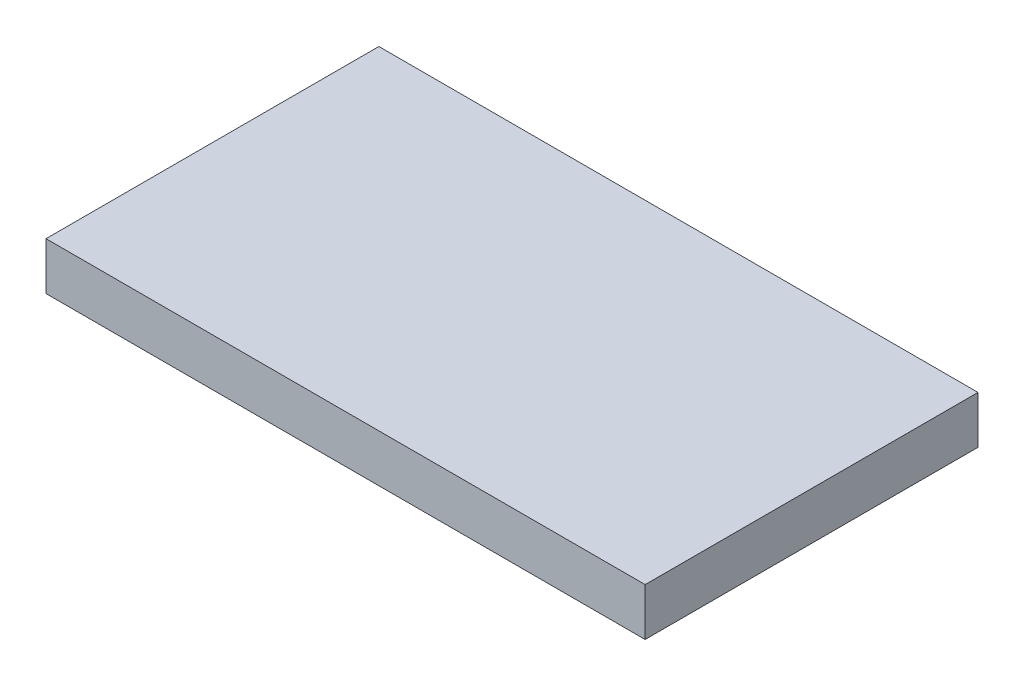
ISO-10303-21;
HEADER;
FILE_DESCRIPTION(('STEP AP214'),'2;1');
FILE_NAME('part.step','',(''),(''),'','','');
FILE_SCHEMA(('AUTOMOTIVE_DESIGN { 1 0 10303 214 1 1 1 1 }'));
ENDSEC;
DATA;
#1=APPLICATION_CONTEXT('core data for automotive mechanical design processes');
#2=APPLICATION_PROTOCOL_DEFINITION('international standard','automotive_design',2000,#1);
#3=PRODUCT_CONTEXT('',#1,'mechanical');
#4=PRODUCT('Part','Part','',(#3));
#5=PRODUCT_RELATED_PRODUCT_CATEGORY('part','',(#4));
#6=PRODUCT_DEFINITION_FORMATION('','',#4);
#7=PRODUCT_DEFINITION_CONTEXT('part definition',#1,'design');
#8=PRODUCT_DEFINITION('design','',#6,#7);
#9=PRODUCT_DEFINITION_SHAPE('','',#8);
#10=(LENGTH_UNIT() NAMED_UNIT(*) SI_UNIT(.MILLI.,.METRE.));
#11=(NAMED_UNIT(*) PLANE_ANGLE_UNIT() SI_UNIT($,.RADIAN.));
#12=(NAMED_UNIT(*) SI_UNIT($,.STERADIAN.) SOLID_ANGLE_UNIT());
#13=UNCERTAINTY_MEASURE_WITH_UNIT(LENGTH_MEASURE(1.E-05),#10,'distance_accuracy_value','');
#14=(GEOMETRIC_REPRESENTATION_CONTEXT(3) GLOBAL_UNCERTAINTY_ASSIGNED_CONTEXT((#13)) GLOBAL_UNIT_ASSIGNED_CONTEXT((#10,
#11,#12)) REPRESENTATION_CONTEXT('',''));
#15=CARTESIAN_POINT('',(0.,0.,0.));
#16=DIRECTION('',(0.,0.,1.));
#17=DIRECTION('',(1.,0.,0.));
#18=AXIS2_PLACEMENT_3D('',#15,#16,#17);
#19=CARTESIAN_POINT('',(-51.6509531623004,5.,-20.3195374115649));
#20=DIRECTION('',(1.,0.,0.));
#21=DIRECTION('',(0.,0.,-1.));
#22=AXIS2_PLACEMENT_3D('',#19,#20,#21);
#23=PLANE('',#22);
#24=DIRECTION('',(0.,0.,1.));
#25=VECTOR('',#24,1.);
#26=CARTESIAN_POINT('',(-51.6509531623004,0.,-20.3195374115649));
#27=LINE('',#26,#25);
#28=CARTESIAN_POINT('',(-51.6509531623004,0.,-20.3195374115649));
#29=VERTEX_POINT('',#28);
#30=CARTESIAN_POINT('',(-51.6509531623004,0.,14.6804625884351));
#31=VERTEX_POINT('',#30);
#32=EDGE_CURVE('E95',#29,#31,#27,.T.);
#33=ORIENTED_EDGE('',*,*,#32,.T.);
#34=DIRECTION('',(0.,-1.,0.));
#35=VECTOR('',#34,1.);
#36=CARTESIAN_POINT('',(-51.6509531623004,5.,14.6804625884351));
#37=LINE('',#36,#35);
#38=CARTESIAN_POINT('',(-51.6509531623004,5.,14.6804625884351));
#39=VERTEX_POINT('',#38);
#40=EDGE_CURVE('E11',#39,#31,#37,.T.);
#41=ORIENTED_EDGE('',*,*,#40,.F.);
#42=DIRECTION('',(0.,0.,1.));
#43=VECTOR('',#42,1.);
#44=CARTESIAN_POINT('',(-51.6509531623004,5.,-20.3195374115649));
#45=LINE('',#44,#43);
#46=CARTESIAN_POINT('',(-51.6509531623004,5.,-20.3195374115649));
#47=VERTEX_POINT('',#46);
#48=EDGE_CURVE('E83',#47,#39,#45,.T.);
#49=ORIENTED_EDGE('',*,*,#48,.F.);
#50=DIRECTION('',(0.,-1.,0.));
#51=VECTOR('',#50,1.);
#52=CARTESIAN_POINT('',(-51.6509531623004,5.,-20.3195374115649));
#53=LINE('',#52,#51);
#54=EDGE_CURVE('E91',#47,#29,#53,.T.);
#55=ORIENTED_EDGE('',*,*,#54,.T.);
#56=EDGE_LOOP('',(#33,#41,#49,#55));
#57=FACE_BOUND('',#56,.T.);
#58=ADVANCED_FACE('F32',(#57),#23,.F.);
#59=CARTESIAN_POINT('',(-51.6509531623004,5.,14.6804625884351));
#60=DIRECTION('',(0.,0.,-1.));
#61=DIRECTION('',(-1.,0.,0.));
#62=AXIS2_PLACEMENT_3D('',#59,#60,#61);
#63=PLANE('',#62);
#64=DIRECTION('',(1.,0.,0.));
#65=VECTOR('',#64,1.);
#66=CARTESIAN_POINT('',(-51.6509531623004,0.,14.6804625884351));
#67=LINE('',#66,#65);
#68=CARTESIAN_POINT('',(11.3490468376996,0.,14.6804625884351));
#69=VERTEX_POINT('',#68);
#70=EDGE_CURVE('E87',#31,#69,#67,.T.);
#71=ORIENTED_EDGE('',*,*,#70,.T.);
#72=DIRECTION('',(0.,-1.,0.));
#73=VECTOR('',#72,1.);
#74=CARTESIAN_POINT('',(11.3490468376996,5.,14.6804625884351));
#75=LINE('',#74,#73);
#76=CARTESIAN_POINT('',(11.3490468376996,5.,14.6804625884351));
#77=VERTEX_POINT('',#76);
#78=EDGE_CURVE('E40',#77,#69,#75,.T.);
#79=ORIENTED_EDGE('',*,*,#78,.F.);
#80=DIRECTION('',(1.,0.,0.));
#81=VECTOR('',#80,1.);
#82=CARTESIAN_POINT('',(-51.6509531623004,5.,14.6804625884351));
#83=LINE('',#82,#81);
#84=EDGE_CURVE('E78',#39,#77,#83,.T.);
#85=ORIENTED_EDGE('',*,*,#84,.F.);
#86=ORIENTED_EDGE('',*,*,#40,.T.);
#87=EDGE_LOOP('',(#71,#79,#85,#86));
#88=FACE_BOUND('',#87,.T.);
#89=ADVANCED_FACE('F86',(#88),#63,.F.);
#90=CARTESIAN_POINT('',(11.3490468376996,5.,-20.3195374115649));
#91=DIRECTION('',(-1.,0.,0.));
#92=DIRECTION('',(0.,0.,1.));
#93=AXIS2_PLACEMENT_3D('',#90,#91,#92);
#94=PLANE('',#93);
#95=DIRECTION('',(0.,0.,-1.));
#96=VECTOR('',#95,1.);
#97=CARTESIAN_POINT('',(11.3490468376996,0.,-20.3195374115649));
#98=LINE('',#97,#96);
#99=CARTESIAN_POINT('',(11.3490468376996,0.,-20.3195374115649));
#100=VERTEX_POINT('',#99);
#101=EDGE_CURVE('E65',#69,#100,#98,.T.);
#102=ORIENTED_EDGE('',*,*,#101,.T.);
#103=DIRECTION('',(0.,-1.,0.));
#104=VECTOR('',#103,1.);
#105=CARTESIAN_POINT('',(11.3490468376996,5.,-20.3195374115649));
#106=LINE('',#105,#104);
#107=CARTESIAN_POINT('',(11.3490468376996,5.,-20.3195374115649));
#108=VERTEX_POINT('',#107);
#109=EDGE_CURVE('E88',#108,#100,#106,.T.);
#110=ORIENTED_EDGE('',*,*,#109,.F.);
#111=DIRECTION('',(0.,0.,-1.));
#112=VECTOR('',#111,1.);
#113=CARTESIAN_POINT('',(11.3490468376996,5.,-20.3195374115649));
#114=LINE('',#113,#112);
#115=EDGE_CURVE('E81',#77,#108,#114,.T.);
#116=ORIENTED_EDGE('',*,*,#115,.F.);
#117=ORIENTED_EDGE('',*,*,#78,.T.);
#118=EDGE_LOOP('',(#102,#110,#116,#117));
#119=FACE_BOUND('',#118,.T.);
#120=ADVANCED_FACE('F89',(#119),#94,.F.);
#121=CARTESIAN_POINT('',(-51.6509531623004,5.,-20.3195374115649));
#122=DIRECTION('',(0.,0.,1.));
#123=DIRECTION('',(1.,0.,0.));
#124=AXIS2_PLACEMENT_3D('',#121,#122,#123);
#125=PLANE('',#124);
#126=DIRECTION('',(-1.,0.,0.));
#127=VECTOR('',#126,1.);
#128=CARTESIAN_POINT('',(-51.6509531623004,0.,-20.3195374115649));
#129=LINE('',#128,#127);
#130=EDGE_CURVE('E71',#100,#29,#129,.T.);
#131=ORIENTED_EDGE('',*,*,#130,.T.);
#132=ORIENTED_EDGE('',*,*,#54,.F.);
#133=DIRECTION('',(-1.,0.,0.));
#134=VECTOR('',#133,1.);
#135=CARTESIAN_POINT('',(-51.6509531623004,5.,-20.3195374115649));
#136=LINE('',#135,#134);
#137=EDGE_CURVE('E48',#108,#47,#136,.T.);
#138=ORIENTED_EDGE('',*,*,#137,.F.);
#139=ORIENTED_EDGE('',*,*,#109,.T.);
#140=EDGE_LOOP('',(#131,#132,#138,#139));
#141=FACE_BOUND('',#140,.T.);
#142=ADVANCED_FACE('F102',(#141),#125,.F.);
#143=CARTESIAN_POINT('',(0.,5.,0.));
#144=DIRECTION('',(0.,1.,0.));
#145=DIRECTION('',(0.,0.,1.));
#146=AXIS2_PLACEMENT_3D('',#143,#144,#145);
#147=PLANE('',#146);
#148=ORIENTED_EDGE('',*,*,#48,.T.);
#149=ORIENTED_EDGE('',*,*,#84,.T.);
#150=ORIENTED_EDGE('',*,*,#115,.T.);
#151=ORIENTED_EDGE('',*,*,#137,.T.);
#152=EDGE_LOOP('',(#148,#149,#150,#151));
#153=FACE_BOUND('',#152,.T.);
#154=ADVANCED_FACE('F79',(#153),#147,.T.);
#155=CARTESIAN_POINT('',(0.,0.,0.));
#156=DIRECTION('',(0.,1.,0.));
#157=DIRECTION('',(0.,0.,1.));
#158=AXIS2_PLACEMENT_3D('',#155,#156,#157);
#159=PLANE('',#158);
#160=ORIENTED_EDGE('',*,*,#32,.F.);
#161=ORIENTED_EDGE('',*,*,#130,.F.);
#162=ORIENTED_EDGE('',*,*,#101,.F.);
#163=ORIENTED_EDGE('',*,*,#70,.F.);
#164=EDGE_LOOP('',(#160,#161,#162,#163));
#165=FACE_BOUND('',#164,.T.);
#166=ADVANCED_FACE('F105',(#165),#159,.F.);
#167=CLOSED_SHELL('',(#58,#89,#120,#142,#154,#166));
#168=MANIFOLD_SOLID_BREP('B2',#167);
#169=ADVANCED_BREP_SHAPE_REPRESENTATION('',(#18,#168),#14);
#170=SHAPE_DEFINITION_REPRESENTATION(#9,#169);
ENDSEC;
END-ISO-10303-21;
